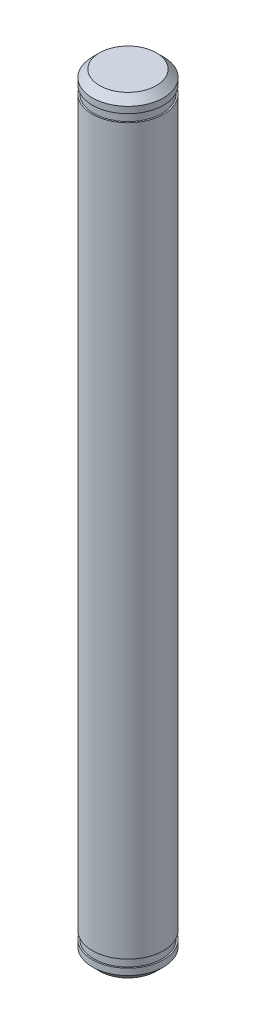
ISO-10303-21;
HEADER;
FILE_DESCRIPTION(('STEP AP214'),'2;1');
FILE_NAME('part.step','',(''),(''),'','','');
FILE_SCHEMA(('AUTOMOTIVE_DESIGN { 1 0 10303 214 1 1 1 1 }'));
ENDSEC;
DATA;
#1=APPLICATION_CONTEXT('core data for automotive mechanical design processes');
#2=APPLICATION_PROTOCOL_DEFINITION('international standard','automotive_design',2000,#1);
#3=PRODUCT_CONTEXT('',#1,'mechanical');
#4=PRODUCT('Part','Part','',(#3));
#5=PRODUCT_RELATED_PRODUCT_CATEGORY('part','',(#4));
#6=PRODUCT_DEFINITION_FORMATION('','',#4);
#7=PRODUCT_DEFINITION_CONTEXT('part definition',#1,'design');
#8=PRODUCT_DEFINITION('design','',#6,#7);
#9=PRODUCT_DEFINITION_SHAPE('','',#8);
#10=(LENGTH_UNIT() NAMED_UNIT(*) SI_UNIT(.MILLI.,.METRE.));
#11=(NAMED_UNIT(*) PLANE_ANGLE_UNIT() SI_UNIT($,.RADIAN.));
#12=(NAMED_UNIT(*) SI_UNIT($,.STERADIAN.) SOLID_ANGLE_UNIT());
#13=UNCERTAINTY_MEASURE_WITH_UNIT(LENGTH_MEASURE(1.E-05),#10,'distance_accuracy_value','');
#14=(GEOMETRIC_REPRESENTATION_CONTEXT(3) GLOBAL_UNCERTAINTY_ASSIGNED_CONTEXT((#13)) GLOBAL_UNIT_ASSIGNED_CONTEXT((#10,
#11,#12)) REPRESENTATION_CONTEXT('',''));
#15=CARTESIAN_POINT('',(0.,0.,0.));
#16=DIRECTION('',(0.,0.,1.));
#17=DIRECTION('',(1.,0.,0.));
#18=AXIS2_PLACEMENT_3D('',#15,#16,#17);
#19=CARTESIAN_POINT('',(0.,54.,0.));
#20=DIRECTION('',(0.,1.,0.));
#21=DIRECTION('',(-1.,0.,0.));
#22=AXIS2_PLACEMENT_3D('',#19,#20,#21);
#23=CYLINDRICAL_SURFACE('',#22,5.00000000000001);
#24=CARTESIAN_POINT('',(0.,51.,0.));
#25=DIRECTION('',(0.,1.,0.));
#26=DIRECTION('',(-1.,0.,0.));
#27=AXIS2_PLACEMENT_3D('',#24,#25,#26);
#28=CIRCLE('',#27,5.00000000000001);
#29=CARTESIAN_POINT('',(-5.00000000000002,51.,0.));
#30=VERTEX_POINT('',#29);
#31=EDGE_CURVE('E57',#30,#30,#28,.T.);
#32=ORIENTED_EDGE('',*,*,#31,.F.);
#33=EDGE_LOOP('',(#32));
#34=FACE_BOUND('',#33,.T.);
#35=CARTESIAN_POINT('',(0.,-51.,0.));
#36=DIRECTION('',(0.,1.,0.));
#37=DIRECTION('',(-1.,0.,0.));
#38=AXIS2_PLACEMENT_3D('',#35,#36,#37);
#39=CIRCLE('',#38,5.00000000000001);
#40=CARTESIAN_POINT('',(-5.,-51.,0.));
#41=VERTEX_POINT('',#40);
#42=EDGE_CURVE('E69',#41,#41,#39,.T.);
#43=ORIENTED_EDGE('',*,*,#42,.T.);
#44=EDGE_LOOP('',(#43));
#45=FACE_BOUND('',#44,.T.);
#46=ADVANCED_FACE('F35',(#34,#45),#23,.T.);
#47=CARTESIAN_POINT('',(0.,54.,0.));
#48=DIRECTION('',(0.,-1.,0.));
#49=DIRECTION('',(1.,0.,0.));
#50=AXIS2_PLACEMENT_3D('',#47,#48,#49);
#51=PLANE('',#50);
#52=CARTESIAN_POINT('',(0.,54.,0.));
#53=DIRECTION('',(0.,-1.,0.));
#54=DIRECTION('',(1.,0.,0.));
#55=AXIS2_PLACEMENT_3D('',#52,#53,#54);
#56=CIRCLE('',#55,4.00000000000002);
#57=CARTESIAN_POINT('',(4.,54.,0.));
#58=VERTEX_POINT('',#57);
#59=EDGE_CURVE('E10',#58,#58,#56,.F.);
#60=ORIENTED_EDGE('',*,*,#59,.T.);
#61=EDGE_LOOP('',(#60));
#62=FACE_BOUND('',#61,.T.);
#63=ADVANCED_FACE('F110',(#62),#51,.F.);
#64=CARTESIAN_POINT('',(0.,52.1,0.));
#65=DIRECTION('',(0.,1.,0.));
#66=DIRECTION('',(-1.,0.,0.));
#67=AXIS2_PLACEMENT_3D('',#64,#65,#66);
#68=CIRCLE('',#67,5.00000000000001);
#69=CARTESIAN_POINT('',(-5.00000000000002,52.1,0.));
#70=VERTEX_POINT('',#69);
#71=EDGE_CURVE('E56',#70,#70,#68,.T.);
#72=ORIENTED_EDGE('',*,*,#71,.T.);
#73=EDGE_LOOP('',(#72));
#74=FACE_BOUND('',#73,.T.);
#75=CARTESIAN_POINT('',(0.,53.,0.));
#76=DIRECTION('',(0.,-1.,0.));
#77=DIRECTION('',(1.,0.,0.));
#78=AXIS2_PLACEMENT_3D('',#75,#76,#77);
#79=CIRCLE('',#78,5.00000000000001);
#80=CARTESIAN_POINT('',(4.99999999999999,53.,0.));
#81=VERTEX_POINT('',#80);
#82=EDGE_CURVE('E51',#81,#81,#79,.T.);
#83=ORIENTED_EDGE('',*,*,#82,.T.);
#84=EDGE_LOOP('',(#83));
#85=FACE_BOUND('',#84,.T.);
#86=ADVANCED_FACE('F97',(#74,#85),#23,.T.);
#87=CARTESIAN_POINT('',(0.,54.,0.));
#88=DIRECTION('',(0.,-1.,0.));
#89=DIRECTION('',(1.,0.,0.));
#90=AXIS2_PLACEMENT_3D('',#87,#88,#89);
#91=CONICAL_SURFACE('',#90,4.00000000000002,0.785398163397446);
#92=ORIENTED_EDGE('',*,*,#82,.F.);
#93=EDGE_LOOP('',(#92));
#94=FACE_BOUND('',#93,.T.);
#95=ORIENTED_EDGE('',*,*,#59,.F.);
#96=EDGE_LOOP('',(#95));
#97=FACE_BOUND('',#96,.T.);
#98=ADVANCED_FACE('F38',(#94,#97),#91,.T.);
#99=CARTESIAN_POINT('',(0.,52.1,0.));
#100=DIRECTION('',(0.,1.,0.));
#101=DIRECTION('',(-1.,0.,0.));
#102=AXIS2_PLACEMENT_3D('',#99,#100,#101);
#103=PLANE('',#102);
#104=ORIENTED_EDGE('',*,*,#71,.F.);
#105=EDGE_LOOP('',(#104));
#106=FACE_BOUND('',#105,.T.);
#107=CARTESIAN_POINT('',(0.,52.1,0.));
#108=DIRECTION('',(0.,1.,0.));
#109=DIRECTION('',(-1.,0.,0.));
#110=AXIS2_PLACEMENT_3D('',#107,#108,#109);
#111=CIRCLE('',#110,4.8);
#112=CARTESIAN_POINT('',(-4.80000000000002,52.1,0.));
#113=VERTEX_POINT('',#112);
#114=EDGE_CURVE('E60',#113,#113,#111,.T.);
#115=ORIENTED_EDGE('',*,*,#114,.T.);
#116=EDGE_LOOP('',(#115));
#117=FACE_BOUND('',#116,.T.);
#118=ADVANCED_FACE('F122',(#106,#117),#103,.F.);
#119=CARTESIAN_POINT('',(0.,51.,0.));
#120=DIRECTION('',(0.,1.,0.));
#121=DIRECTION('',(-1.,0.,0.));
#122=AXIS2_PLACEMENT_3D('',#119,#120,#121);
#123=PLANE('',#122);
#124=ORIENTED_EDGE('',*,*,#31,.T.);
#125=EDGE_LOOP('',(#124));
#126=FACE_BOUND('',#125,.T.);
#127=CARTESIAN_POINT('',(0.,51.,0.));
#128=DIRECTION('',(0.,1.,0.));
#129=DIRECTION('',(-1.,0.,0.));
#130=AXIS2_PLACEMENT_3D('',#127,#128,#129);
#131=CIRCLE('',#130,4.8);
#132=CARTESIAN_POINT('',(-4.80000000000002,51.,0.));
#133=VERTEX_POINT('',#132);
#134=EDGE_CURVE('E63',#133,#133,#131,.T.);
#135=ORIENTED_EDGE('',*,*,#134,.F.);
#136=EDGE_LOOP('',(#135));
#137=FACE_BOUND('',#136,.T.);
#138=ADVANCED_FACE('F131',(#126,#137),#123,.T.);
#139=CARTESIAN_POINT('',(0.,52.1,0.));
#140=DIRECTION('',(0.,-1.,0.));
#141=DIRECTION('',(1.,0.,0.));
#142=AXIS2_PLACEMENT_3D('',#139,#140,#141);
#143=CYLINDRICAL_SURFACE('',#142,4.8);
#144=ORIENTED_EDGE('',*,*,#114,.F.);
#145=EDGE_LOOP('',(#144));
#146=FACE_BOUND('',#145,.T.);
#147=ORIENTED_EDGE('',*,*,#134,.T.);
#148=EDGE_LOOP('',(#147));
#149=FACE_BOUND('',#148,.T.);
#150=ADVANCED_FACE('F88',(#146,#149),#143,.T.);
#151=CARTESIAN_POINT('',(0.,-52.1,0.));
#152=DIRECTION('',(0.,-1.,0.));
#153=DIRECTION('',(-1.,0.,0.));
#154=AXIS2_PLACEMENT_3D('',#151,#152,#153);
#155=PLANE('',#154);
#156=CARTESIAN_POINT('',(0.,-52.1,0.));
#157=DIRECTION('',(0.,1.,0.));
#158=DIRECTION('',(-1.,0.,0.));
#159=AXIS2_PLACEMENT_3D('',#156,#157,#158);
#160=CIRCLE('',#159,4.8);
#161=CARTESIAN_POINT('',(-4.79999999999999,-52.1,0.));
#162=VERTEX_POINT('',#161);
#163=EDGE_CURVE('E72',#162,#162,#160,.T.);
#164=ORIENTED_EDGE('',*,*,#163,.F.);
#165=EDGE_LOOP('',(#164));
#166=FACE_BOUND('',#165,.T.);
#167=CARTESIAN_POINT('',(0.,-52.1,0.));
#168=DIRECTION('',(0.,1.,0.));
#169=DIRECTION('',(-1.,0.,0.));
#170=AXIS2_PLACEMENT_3D('',#167,#168,#169);
#171=CIRCLE('',#170,5.00000000000001);
#172=CARTESIAN_POINT('',(-5.,-52.1,0.));
#173=VERTEX_POINT('',#172);
#174=EDGE_CURVE('E66',#173,#173,#171,.T.);
#175=ORIENTED_EDGE('',*,*,#174,.T.);
#176=EDGE_LOOP('',(#175));
#177=FACE_BOUND('',#176,.T.);
#178=ADVANCED_FACE('F84',(#166,#177),#155,.F.);
#179=CARTESIAN_POINT('',(0.,-51.,0.));
#180=DIRECTION('',(0.,-1.,0.));
#181=DIRECTION('',(-1.,0.,0.));
#182=AXIS2_PLACEMENT_3D('',#179,#180,#181);
#183=PLANE('',#182);
#184=CARTESIAN_POINT('',(0.,-51.,0.));
#185=DIRECTION('',(0.,1.,0.));
#186=DIRECTION('',(-1.,0.,0.));
#187=AXIS2_PLACEMENT_3D('',#184,#185,#186);
#188=CIRCLE('',#187,4.8);
#189=CARTESIAN_POINT('',(-4.79999999999999,-51.,0.));
#190=VERTEX_POINT('',#189);
#191=EDGE_CURVE('E75',#190,#190,#188,.T.);
#192=ORIENTED_EDGE('',*,*,#191,.T.);
#193=EDGE_LOOP('',(#192));
#194=FACE_BOUND('',#193,.T.);
#195=ORIENTED_EDGE('',*,*,#42,.F.);
#196=EDGE_LOOP('',(#195));
#197=FACE_BOUND('',#196,.T.);
#198=ADVANCED_FACE('F87',(#194,#197),#183,.T.);
#199=CARTESIAN_POINT('',(0.,-52.1,0.));
#200=DIRECTION('',(0.,1.,0.));
#201=DIRECTION('',(-1.,0.,0.));
#202=AXIS2_PLACEMENT_3D('',#199,#200,#201);
#203=CYLINDRICAL_SURFACE('',#202,4.8);
#204=ORIENTED_EDGE('',*,*,#163,.T.);
#205=EDGE_LOOP('',(#204));
#206=FACE_BOUND('',#205,.T.);
#207=ORIENTED_EDGE('',*,*,#191,.F.);
#208=EDGE_LOOP('',(#207));
#209=FACE_BOUND('',#208,.T.);
#210=ADVANCED_FACE('F81',(#206,#209),#203,.T.);
#211=CARTESIAN_POINT('',(5.00000000000001,-54.,0.));
#212=DIRECTION('',(0.,1.,0.));
#213=DIRECTION('',(-1.,0.,0.));
#214=AXIS2_PLACEMENT_3D('',#211,#212,#213);
#215=PLANE('',#214);
#216=CARTESIAN_POINT('',(0.,-54.,0.));
#217=DIRECTION('',(0.,1.,0.));
#218=DIRECTION('',(-1.,0.,0.));
#219=AXIS2_PLACEMENT_3D('',#216,#217,#218);
#220=CIRCLE('',#219,3.99999999999999);
#221=CARTESIAN_POINT('',(-3.99999999999998,-54.,0.));
#222=VERTEX_POINT('',#221);
#223=EDGE_CURVE('E43',#222,#222,#220,.F.);
#224=ORIENTED_EDGE('',*,*,#223,.T.);
#225=EDGE_LOOP('',(#224));
#226=FACE_BOUND('',#225,.T.);
#227=ADVANCED_FACE('F101',(#226),#215,.F.);
#228=CARTESIAN_POINT('',(0.,-53.,0.));
#229=DIRECTION('',(0.,1.,0.));
#230=DIRECTION('',(-1.,0.,0.));
#231=AXIS2_PLACEMENT_3D('',#228,#229,#230);
#232=CONICAL_SURFACE('',#231,5.00000000000001,0.78539816339745);
#233=ORIENTED_EDGE('',*,*,#223,.F.);
#234=EDGE_LOOP('',(#233));
#235=FACE_BOUND('',#234,.T.);
#236=CARTESIAN_POINT('',(0.,-53.,0.));
#237=DIRECTION('',(0.,1.,0.));
#238=DIRECTION('',(-1.,0.,0.));
#239=AXIS2_PLACEMENT_3D('',#236,#237,#238);
#240=CIRCLE('',#239,5.00000000000001);
#241=CARTESIAN_POINT('',(-5.,-53.,0.));
#242=VERTEX_POINT('',#241);
#243=EDGE_CURVE('E47',#242,#242,#240,.T.);
#244=ORIENTED_EDGE('',*,*,#243,.F.);
#245=EDGE_LOOP('',(#244));
#246=FACE_BOUND('',#245,.T.);
#247=ADVANCED_FACE('F95',(#235,#246),#232,.T.);
#248=ORIENTED_EDGE('',*,*,#174,.F.);
#249=EDGE_LOOP('',(#248));
#250=FACE_BOUND('',#249,.T.);
#251=ORIENTED_EDGE('',*,*,#243,.T.);
#252=EDGE_LOOP('',(#251));
#253=FACE_BOUND('',#252,.T.);
#254=ADVANCED_FACE('F92',(#250,#253),#23,.T.);
#255=CLOSED_SHELL('',(#46,#63,#86,#98,#118,#138,#150,#178,#198,#210,#227,#247,#254));
#256=MANIFOLD_SOLID_BREP('B2',#255);
#257=ADVANCED_BREP_SHAPE_REPRESENTATION('',(#18,#256),#14);
#258=SHAPE_DEFINITION_REPRESENTATION(#9,#257);
ENDSEC;
END-ISO-10303-21;
